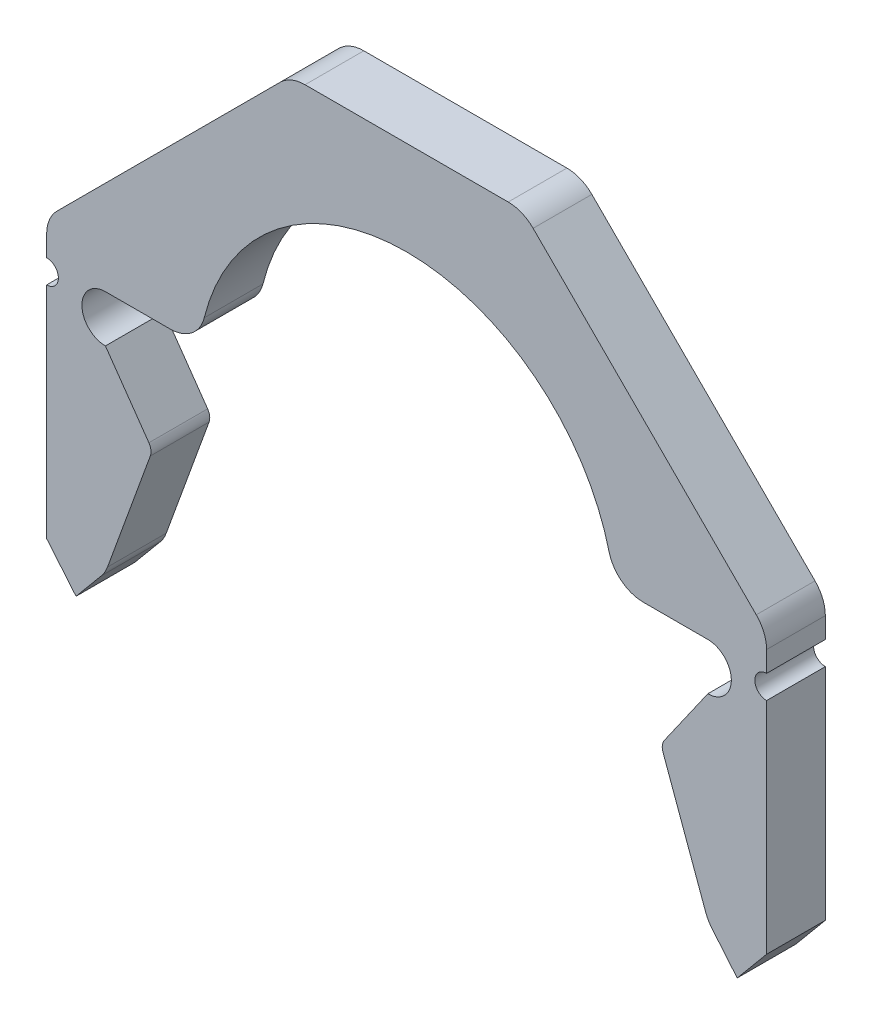
ISO-10303-21;
HEADER;
FILE_DESCRIPTION(('STEP AP214'),'2;1');
FILE_NAME('part.step','',(''),(''),'','','');
FILE_SCHEMA(('AUTOMOTIVE_DESIGN { 1 0 10303 214 1 1 1 1 }'));
ENDSEC;
DATA;
#1=APPLICATION_CONTEXT('core data for automotive mechanical design processes');
#2=APPLICATION_PROTOCOL_DEFINITION('international standard','automotive_design',2000,#1);
#3=PRODUCT_CONTEXT('',#1,'mechanical');
#4=PRODUCT('Part','Part','',(#3));
#5=PRODUCT_RELATED_PRODUCT_CATEGORY('part','',(#4));
#6=PRODUCT_DEFINITION_FORMATION('','',#4);
#7=PRODUCT_DEFINITION_CONTEXT('part definition',#1,'design');
#8=PRODUCT_DEFINITION('design','',#6,#7);
#9=PRODUCT_DEFINITION_SHAPE('','',#8);
#10=(LENGTH_UNIT() NAMED_UNIT(*) SI_UNIT(.MILLI.,.METRE.));
#11=(NAMED_UNIT(*) PLANE_ANGLE_UNIT() SI_UNIT($,.RADIAN.));
#12=(NAMED_UNIT(*) SI_UNIT($,.STERADIAN.) SOLID_ANGLE_UNIT());
#13=UNCERTAINTY_MEASURE_WITH_UNIT(LENGTH_MEASURE(1.E-05),#10,'distance_accuracy_value','');
#14=(GEOMETRIC_REPRESENTATION_CONTEXT(3) GLOBAL_UNCERTAINTY_ASSIGNED_CONTEXT((#13)) GLOBAL_UNIT_ASSIGNED_CONTEXT((#10,
#11,#12)) REPRESENTATION_CONTEXT('',''));
#15=CARTESIAN_POINT('',(0.,0.,0.));
#16=DIRECTION('',(0.,0.,1.));
#17=DIRECTION('',(1.,0.,0.));
#18=AXIS2_PLACEMENT_3D('',#15,#16,#17);
#19=CARTESIAN_POINT('',(-25.6369640244573,0.,2.5));
#20=DIRECTION('',(0.,0.,-1.));
#21=DIRECTION('',(-1.,0.,0.));
#22=AXIS2_PLACEMENT_3D('',#19,#20,#21);
#23=CYLINDRICAL_SURFACE('',#22,2.);
#24=CARTESIAN_POINT('',(-25.6369640244573,0.,-2.5));
#25=DIRECTION('',(0.,0.,1.));
#26=DIRECTION('',(1.,0.,0.));
#27=AXIS2_PLACEMENT_3D('',#24,#25,#26);
#28=CIRCLE('',#27,2.);
#29=CARTESIAN_POINT('',(-25.6369640244573,2.,-2.5));
#30=VERTEX_POINT('',#29);
#31=CARTESIAN_POINT('',(-25.6369640244573,-2.,-2.5));
#32=VERTEX_POINT('',#31);
#33=EDGE_CURVE('E256',#30,#32,#28,.T.);
#34=ORIENTED_EDGE('',*,*,#33,.F.);
#35=DIRECTION('',(0.,0.,-1.));
#36=VECTOR('',#35,1.);
#37=CARTESIAN_POINT('',(-25.6369640244573,2.,2.5));
#38=LINE('',#37,#36);
#39=CARTESIAN_POINT('',(-25.6369640244573,2.,2.5));
#40=VERTEX_POINT('',#39);
#41=EDGE_CURVE('E251',#40,#30,#38,.T.);
#42=ORIENTED_EDGE('',*,*,#41,.F.);
#43=CARTESIAN_POINT('',(-25.6369640244573,0.,2.5));
#44=DIRECTION('',(0.,0.,1.));
#45=DIRECTION('',(1.,0.,0.));
#46=AXIS2_PLACEMENT_3D('',#43,#44,#45);
#47=CIRCLE('',#46,2.);
#48=CARTESIAN_POINT('',(-25.6369640244573,-2.,2.5));
#49=VERTEX_POINT('',#48);
#50=EDGE_CURVE('E254',#40,#49,#47,.T.);
#51=ORIENTED_EDGE('',*,*,#50,.T.);
#52=DIRECTION('',(0.,0.,-1.));
#53=VECTOR('',#52,1.);
#54=CARTESIAN_POINT('',(-25.6369640244573,-2.,2.5));
#55=LINE('',#54,#53);
#56=EDGE_CURVE('E350',#49,#32,#55,.T.);
#57=ORIENTED_EDGE('',*,*,#56,.T.);
#58=EDGE_LOOP('',(#34,#42,#51,#57));
#59=FACE_BOUND('',#58,.T.);
#60=ADVANCED_FACE('F41',(#59),#23,.F.);
#61=CARTESIAN_POINT('',(0.,2.,2.5));
#62=DIRECTION('',(0.,1.,0.));
#63=DIRECTION('',(0.,0.,1.));
#64=AXIS2_PLACEMENT_3D('',#61,#62,#63);
#65=PLANE('',#64);
#66=DIRECTION('',(1.,0.,0.));
#67=VECTOR('',#66,1.);
#68=CARTESIAN_POINT('',(0.,2.,-2.5));
#69=LINE('',#68,#67);
#70=CARTESIAN_POINT('',(-20.1385823731463,2.,-2.5));
#71=VERTEX_POINT('',#70);
#72=EDGE_CURVE('E353',#30,#71,#69,.T.);
#73=ORIENTED_EDGE('',*,*,#72,.T.);
#74=DIRECTION('',(0.,0.,1.));
#75=VECTOR('',#74,1.);
#76=CARTESIAN_POINT('',(-20.1385823731463,2.,2.5));
#77=LINE('',#76,#75);
#78=CARTESIAN_POINT('',(-20.1385823731463,2.,2.5));
#79=VERTEX_POINT('',#78);
#80=EDGE_CURVE('E268',#71,#79,#77,.T.);
#81=ORIENTED_EDGE('',*,*,#80,.T.);
#82=DIRECTION('',(1.,0.,0.));
#83=VECTOR('',#82,1.);
#84=CARTESIAN_POINT('',(0.,2.,2.5));
#85=LINE('',#84,#83);
#86=EDGE_CURVE('E265',#40,#79,#85,.T.);
#87=ORIENTED_EDGE('',*,*,#86,.F.);
#88=ORIENTED_EDGE('',*,*,#41,.T.);
#89=EDGE_LOOP('',(#73,#81,#87,#88));
#90=FACE_BOUND('',#89,.T.);
#91=ADVANCED_FACE('F266',(#90),#65,.F.);
#92=CARTESIAN_POINT('',(0.,0.,2.5));
#93=DIRECTION('',(0.,0.,-1.));
#94=DIRECTION('',(-1.,0.,0.));
#95=AXIS2_PLACEMENT_3D('',#92,#93,#94);
#96=CYLINDRICAL_SURFACE('',#95,17.75);
#97=CARTESIAN_POINT('',(0.,0.,-2.5));
#98=DIRECTION('',(0.,0.,1.));
#99=DIRECTION('',(1.,0.,0.));
#100=AXIS2_PLACEMENT_3D('',#97,#98,#99);
#101=CIRCLE('',#100,17.75);
#102=CARTESIAN_POINT('',(17.22698010233,4.27710843373494,-2.5));
#103=VERTEX_POINT('',#102);
#104=CARTESIAN_POINT('',(-17.22698010233,4.27710843373494,-2.5));
#105=VERTEX_POINT('',#104);
#106=EDGE_CURVE('E356',#103,#105,#101,.T.);
#107=ORIENTED_EDGE('',*,*,#106,.F.);
#108=DIRECTION('',(0.,0.,-1.));
#109=VECTOR('',#108,1.);
#110=CARTESIAN_POINT('',(17.22698010233,4.27710843373494,2.5));
#111=LINE('',#110,#109);
#112=CARTESIAN_POINT('',(17.22698010233,4.27710843373494,2.5));
#113=VERTEX_POINT('',#112);
#114=EDGE_CURVE('E560',#103,#113,#111,.F.);
#115=ORIENTED_EDGE('',*,*,#114,.T.);
#116=CARTESIAN_POINT('',(0.,0.,2.5));
#117=DIRECTION('',(0.,0.,1.));
#118=DIRECTION('',(1.,0.,0.));
#119=AXIS2_PLACEMENT_3D('',#116,#117,#118);
#120=CIRCLE('',#119,17.75);
#121=CARTESIAN_POINT('',(-17.22698010233,4.27710843373494,2.5));
#122=VERTEX_POINT('',#121);
#123=EDGE_CURVE('E271',#113,#122,#120,.T.);
#124=ORIENTED_EDGE('',*,*,#123,.T.);
#125=DIRECTION('',(0.,0.,-1.));
#126=VECTOR('',#125,1.);
#127=CARTESIAN_POINT('',(-17.22698010233,4.27710843373494,2.5));
#128=LINE('',#127,#126);
#129=EDGE_CURVE('E556',#122,#105,#128,.T.);
#130=ORIENTED_EDGE('',*,*,#129,.T.);
#131=EDGE_LOOP('',(#107,#115,#124,#130));
#132=FACE_BOUND('',#131,.T.);
#133=ADVANCED_FACE('F599',(#132),#96,.F.);
#134=CARTESIAN_POINT('',(0.,2.,2.5));
#135=DIRECTION('',(0.,-1.,0.));
#136=DIRECTION('',(0.,0.,-1.));
#137=AXIS2_PLACEMENT_3D('',#134,#135,#136);
#138=PLANE('',#137);
#139=DIRECTION('',(-1.,0.,0.));
#140=VECTOR('',#139,1.);
#141=CARTESIAN_POINT('',(0.,2.,2.5));
#142=LINE('',#141,#140);
#143=CARTESIAN_POINT('',(25.6369640244573,2.,2.5));
#144=VERTEX_POINT('',#143);
#145=CARTESIAN_POINT('',(20.1385823731463,2.,2.5));
#146=VERTEX_POINT('',#145);
#147=EDGE_CURVE('E287',#144,#146,#142,.T.);
#148=ORIENTED_EDGE('',*,*,#147,.T.);
#149=DIRECTION('',(0.,0.,-1.));
#150=VECTOR('',#149,1.);
#151=CARTESIAN_POINT('',(20.1385823731463,2.,2.5));
#152=LINE('',#151,#150);
#153=CARTESIAN_POINT('',(20.1385823731463,2.,-2.5));
#154=VERTEX_POINT('',#153);
#155=EDGE_CURVE('E552',#146,#154,#152,.T.);
#156=ORIENTED_EDGE('',*,*,#155,.T.);
#157=DIRECTION('',(-1.,0.,0.));
#158=VECTOR('',#157,1.);
#159=CARTESIAN_POINT('',(0.,2.,-2.5));
#160=LINE('',#159,#158);
#161=CARTESIAN_POINT('',(25.6369640244573,2.,-2.5));
#162=VERTEX_POINT('',#161);
#163=EDGE_CURVE('E360',#162,#154,#160,.T.);
#164=ORIENTED_EDGE('',*,*,#163,.F.);
#165=DIRECTION('',(0.,0.,-1.));
#166=VECTOR('',#165,1.);
#167=CARTESIAN_POINT('',(25.6369640244573,2.,2.5));
#168=LINE('',#167,#166);
#169=EDGE_CURVE('E262',#144,#162,#168,.T.);
#170=ORIENTED_EDGE('',*,*,#169,.F.);
#171=EDGE_LOOP('',(#148,#156,#164,#170));
#172=FACE_BOUND('',#171,.T.);
#173=ADVANCED_FACE('F606',(#172),#138,.T.);
#174=CARTESIAN_POINT('',(25.6369640244573,0.,2.5));
#175=DIRECTION('',(0.,0.,-1.));
#176=DIRECTION('',(-1.,0.,0.));
#177=AXIS2_PLACEMENT_3D('',#174,#175,#176);
#178=CYLINDRICAL_SURFACE('',#177,2.);
#179=CARTESIAN_POINT('',(25.6369640244573,0.,-2.5));
#180=DIRECTION('',(0.,0.,1.));
#181=DIRECTION('',(1.,0.,0.));
#182=AXIS2_PLACEMENT_3D('',#179,#180,#181);
#183=CIRCLE('',#182,2.);
#184=CARTESIAN_POINT('',(25.6369640244573,-2.,-2.5));
#185=VERTEX_POINT('',#184);
#186=EDGE_CURVE('E364',#162,#185,#183,.F.);
#187=ORIENTED_EDGE('',*,*,#186,.T.);
#188=DIRECTION('',(0.,0.,-1.));
#189=VECTOR('',#188,1.);
#190=CARTESIAN_POINT('',(25.6369640244573,-2.,2.5));
#191=LINE('',#190,#189);
#192=CARTESIAN_POINT('',(25.6369640244573,-2.,2.5));
#193=VERTEX_POINT('',#192);
#194=EDGE_CURVE('E454',#193,#185,#191,.T.);
#195=ORIENTED_EDGE('',*,*,#194,.F.);
#196=CARTESIAN_POINT('',(25.6369640244573,0.,2.5));
#197=DIRECTION('',(0.,0.,1.));
#198=DIRECTION('',(1.,0.,0.));
#199=AXIS2_PLACEMENT_3D('',#196,#197,#198);
#200=CIRCLE('',#199,2.);
#201=EDGE_CURVE('E291',#144,#193,#200,.F.);
#202=ORIENTED_EDGE('',*,*,#201,.F.);
#203=ORIENTED_EDGE('',*,*,#169,.T.);
#204=EDGE_LOOP('',(#187,#195,#202,#203));
#205=FACE_BOUND('',#204,.T.);
#206=ADVANCED_FACE('F612',(#205),#178,.F.);
#207=CARTESIAN_POINT('',(18.1423536880544,-12.7034128132425,2.5));
#208=DIRECTION('',(0.819152044288989,-0.57357643635105,0.));
#209=DIRECTION('',(0.57357643635105,0.819152044288989,0.));
#210=AXIS2_PLACEMENT_3D('',#207,#208,#209);
#211=PLANE('',#210);
#212=DIRECTION('',(-0.57357643635105,-0.819152044288989,0.));
#213=VECTOR('',#212,1.);
#214=CARTESIAN_POINT('',(18.1423536880544,-12.7034128132425,-2.5));
#215=LINE('',#214,#213);
#216=CARTESIAN_POINT('',(21.9355490181945,-7.28616846331944,-2.5));
#217=VERTEX_POINT('',#216);
#218=EDGE_CURVE('E367',#185,#217,#215,.T.);
#219=ORIENTED_EDGE('',*,*,#218,.T.);
#220=DIRECTION('',(0.,0.,-1.));
#221=VECTOR('',#220,1.);
#222=CARTESIAN_POINT('',(21.9355490181945,-7.28616846331945,2.5));
#223=LINE('',#222,#221);
#224=CARTESIAN_POINT('',(21.9355490181945,-7.28616846331944,2.5));
#225=VERTEX_POINT('',#224);
#226=EDGE_CURVE('E575',#217,#225,#223,.F.);
#227=ORIENTED_EDGE('',*,*,#226,.T.);
#228=DIRECTION('',(-0.57357643635105,-0.819152044288989,0.));
#229=VECTOR('',#228,1.);
#230=CARTESIAN_POINT('',(18.1423536880544,-12.7034128132425,2.5));
#231=LINE('',#230,#229);
#232=EDGE_CURVE('E294',#193,#225,#231,.T.);
#233=ORIENTED_EDGE('',*,*,#232,.F.);
#234=ORIENTED_EDGE('',*,*,#194,.T.);
#235=EDGE_LOOP('',(#219,#227,#233,#234));
#236=FACE_BOUND('',#235,.T.);
#237=ADVANCED_FACE('F800',(#236),#211,.F.);
#238=CARTESIAN_POINT('',(16.6271407439279,6.05178431174444,2.5));
#239=DIRECTION('',(0.93969262078591,0.342020143325663,0.));
#240=DIRECTION('',(-0.342020143325663,0.93969262078591,0.));
#241=AXIS2_PLACEMENT_3D('',#238,#239,#240);
#242=PLANE('',#241);
#243=DIRECTION('',(0.342020143325663,-0.939692620785911,0.));
#244=VECTOR('',#243,1.);
#245=CARTESIAN_POINT('',(16.6271407439279,6.05178431174444,2.5));
#246=LINE('',#245,#244);
#247=CARTESIAN_POINT('',(21.8150084416976,-8.20176504299616,2.5));
#248=VERTEX_POINT('',#247);
#249=CARTESIAN_POINT('',(25.4578364086014,-18.2103526250223,2.5));
#250=VERTEX_POINT('',#249);
#251=EDGE_CURVE('E297',#248,#250,#246,.T.);
#252=ORIENTED_EDGE('',*,*,#251,.F.);
#253=DIRECTION('',(0.,0.,-1.));
#254=VECTOR('',#253,1.);
#255=CARTESIAN_POINT('',(21.8150084416976,-8.20176504299616,2.5));
#256=LINE('',#255,#254);
#257=CARTESIAN_POINT('',(21.8150084416976,-8.20176504299616,-2.5));
#258=VERTEX_POINT('',#257);
#259=EDGE_CURVE('E565',#248,#258,#256,.T.);
#260=ORIENTED_EDGE('',*,*,#259,.T.);
#261=DIRECTION('',(0.342020143325663,-0.939692620785911,0.));
#262=VECTOR('',#261,1.);
#263=CARTESIAN_POINT('',(16.6271407439279,6.05178431174444,-2.5));
#264=LINE('',#263,#262);
#265=CARTESIAN_POINT('',(25.4578364086014,-18.2103526250223,-2.5));
#266=VERTEX_POINT('',#265);
#267=EDGE_CURVE('E371',#258,#266,#264,.T.);
#268=ORIENTED_EDGE('',*,*,#267,.T.);
#269=DIRECTION('',(0.,0.,-1.));
#270=VECTOR('',#269,1.);
#271=CARTESIAN_POINT('',(25.4578364086014,-18.2103526250223,2.5));
#272=LINE('',#271,#270);
#273=EDGE_CURVE('E488',#266,#250,#272,.F.);
#274=ORIENTED_EDGE('',*,*,#273,.T.);
#275=EDGE_LOOP('',(#252,#260,#268,#274));
#276=FACE_BOUND('',#275,.T.);
#277=ADVANCED_FACE('F622',(#276),#242,.F.);
#278=CARTESIAN_POINT('',(5.93205989732539,4.94338324777116,2.5));
#279=DIRECTION('',(0.768221279597376,0.64018439966448,0.));
#280=DIRECTION('',(-0.64018439966448,0.768221279597376,0.));
#281=AXIS2_PLACEMENT_3D('',#278,#279,#280);
#282=PLANE('',#281);
#283=DIRECTION('',(0.64018439966448,-0.768221279597376,0.));
#284=VECTOR('',#283,1.);
#285=CARTESIAN_POINT('',(5.93205989732539,4.94338324777116,2.5));
#286=LINE('',#285,#284);
#287=CARTESIAN_POINT('',(25.972250432167,-19.1048453940388,2.5));
#288=VERTEX_POINT('',#287);
#289=CARTESIAN_POINT('',(28.1369640244573,-21.7025017047871,2.5));
#290=VERTEX_POINT('',#289);
#291=EDGE_CURVE('E300',#288,#290,#286,.T.);
#292=ORIENTED_EDGE('',*,*,#291,.F.);
#293=DIRECTION('',(0.,0.,-1.));
#294=VECTOR('',#293,1.);
#295=CARTESIAN_POINT('',(25.972250432167,-19.1048453940388,2.5));
#296=LINE('',#295,#294);
#297=CARTESIAN_POINT('',(25.972250432167,-19.1048453940388,-2.5));
#298=VERTEX_POINT('',#297);
#299=EDGE_CURVE('E261',#288,#298,#296,.T.);
#300=ORIENTED_EDGE('',*,*,#299,.T.);
#301=DIRECTION('',(0.64018439966448,-0.768221279597376,0.));
#302=VECTOR('',#301,1.);
#303=CARTESIAN_POINT('',(5.93205989732539,4.94338324777116,-2.5));
#304=LINE('',#303,#302);
#305=CARTESIAN_POINT('',(28.1369640244573,-21.7025017047871,-2.5));
#306=VERTEX_POINT('',#305);
#307=EDGE_CURVE('E374',#298,#306,#304,.T.);
#308=ORIENTED_EDGE('',*,*,#307,.T.);
#309=DIRECTION('',(0.,0.,-1.));
#310=VECTOR('',#309,1.);
#311=CARTESIAN_POINT('',(28.1369640244573,-21.7025017047871,2.5));
#312=LINE('',#311,#310);
#313=EDGE_CURVE('E450',#290,#306,#312,.T.);
#314=ORIENTED_EDGE('',*,*,#313,.F.);
#315=EDGE_LOOP('',(#292,#300,#308,#314));
#316=FACE_BOUND('',#315,.T.);
#317=ADVANCED_FACE('F634',(#316),#282,.F.);
#318=CARTESIAN_POINT('',(27.2787828856406,-22.7323190713671,2.5));
#319=DIRECTION('',(-0.768221279597376,0.64018439966448,0.));
#320=DIRECTION('',(-0.64018439966448,-0.768221279597376,0.));
#321=AXIS2_PLACEMENT_3D('',#318,#319,#320);
#322=PLANE('',#321);
#323=DIRECTION('',(0.64018439966448,0.768221279597376,0.));
#324=VECTOR('',#323,1.);
#325=CARTESIAN_POINT('',(27.2787828856406,-22.7323190713671,-2.5));
#326=LINE('',#325,#324);
#327=CARTESIAN_POINT('',(30.6369640244573,-18.7025017047871,-2.5));
#328=VERTEX_POINT('',#327);
#329=EDGE_CURVE('E377',#306,#328,#326,.T.);
#330=ORIENTED_EDGE('',*,*,#329,.T.);
#331=DIRECTION('',(0.,0.,-1.));
#332=VECTOR('',#331,1.);
#333=CARTESIAN_POINT('',(30.6369640244573,-18.7025017047871,2.5));
#334=LINE('',#333,#332);
#335=CARTESIAN_POINT('',(30.6369640244573,-18.7025017047871,2.5));
#336=VERTEX_POINT('',#335);
#337=EDGE_CURVE('E447',#336,#328,#334,.T.);
#338=ORIENTED_EDGE('',*,*,#337,.F.);
#339=DIRECTION('',(0.64018439966448,0.768221279597376,0.));
#340=VECTOR('',#339,1.);
#341=CARTESIAN_POINT('',(27.2787828856406,-22.7323190713671,2.5));
#342=LINE('',#341,#340);
#343=EDGE_CURVE('E303',#290,#336,#342,.T.);
#344=ORIENTED_EDGE('',*,*,#343,.F.);
#345=ORIENTED_EDGE('',*,*,#313,.T.);
#346=EDGE_LOOP('',(#330,#338,#344,#345));
#347=FACE_BOUND('',#346,.T.);
#348=ADVANCED_FACE('F638',(#347),#322,.F.);
#349=CARTESIAN_POINT('',(30.6369640244573,0.,2.5));
#350=DIRECTION('',(1.,0.,0.));
#351=DIRECTION('',(0.,1.,0.));
#352=AXIS2_PLACEMENT_3D('',#349,#350,#351);
#353=PLANE('',#352);
#354=DIRECTION('',(0.,-1.,0.));
#355=VECTOR('',#354,1.);
#356=CARTESIAN_POINT('',(30.6369640244573,0.,-2.5));
#357=LINE('',#356,#355);
#358=CARTESIAN_POINT('',(30.6369640244573,0.,-2.5));
#359=VERTEX_POINT('',#358);
#360=EDGE_CURVE('E381',#359,#328,#357,.T.);
#361=ORIENTED_EDGE('',*,*,#360,.F.);
#362=DIRECTION('',(0.,0.,-1.));
#363=VECTOR('',#362,1.);
#364=CARTESIAN_POINT('',(30.6369640244573,0.,2.5));
#365=LINE('',#364,#363);
#366=CARTESIAN_POINT('',(30.6369640244573,0.,2.5));
#367=VERTEX_POINT('',#366);
#368=EDGE_CURVE('E444',#367,#359,#365,.T.);
#369=ORIENTED_EDGE('',*,*,#368,.F.);
#370=DIRECTION('',(0.,-1.,0.));
#371=VECTOR('',#370,1.);
#372=CARTESIAN_POINT('',(30.6369640244573,0.,2.5));
#373=LINE('',#372,#371);
#374=EDGE_CURVE('E306',#367,#336,#373,.T.);
#375=ORIENTED_EDGE('',*,*,#374,.T.);
#376=ORIENTED_EDGE('',*,*,#337,.T.);
#377=EDGE_LOOP('',(#361,#369,#375,#376));
#378=FACE_BOUND('',#377,.T.);
#379=ADVANCED_FACE('F871',(#378),#353,.T.);
#380=CARTESIAN_POINT('',(30.6369640244573,1.,2.5));
#381=DIRECTION('',(0.,0.,-1.));
#382=DIRECTION('',(-1.,0.,0.));
#383=AXIS2_PLACEMENT_3D('',#380,#381,#382);
#384=CYLINDRICAL_SURFACE('',#383,1.);
#385=CARTESIAN_POINT('',(30.6369640244573,1.,-2.5));
#386=DIRECTION('',(0.,0.,1.));
#387=DIRECTION('',(1.,0.,0.));
#388=AXIS2_PLACEMENT_3D('',#385,#386,#387);
#389=CIRCLE('',#388,1.);
#390=CARTESIAN_POINT('',(30.6369640244573,2.,-2.5));
#391=VERTEX_POINT('',#390);
#392=EDGE_CURVE('E385',#391,#359,#389,.T.);
#393=ORIENTED_EDGE('',*,*,#392,.F.);
#394=DIRECTION('',(0.,0.,-1.));
#395=VECTOR('',#394,1.);
#396=CARTESIAN_POINT('',(30.6369640244573,2.,2.5));
#397=LINE('',#396,#395);
#398=CARTESIAN_POINT('',(30.6369640244573,2.,2.5));
#399=VERTEX_POINT('',#398);
#400=EDGE_CURVE('E440',#399,#391,#397,.T.);
#401=ORIENTED_EDGE('',*,*,#400,.F.);
#402=CARTESIAN_POINT('',(30.6369640244573,1.,2.5));
#403=DIRECTION('',(0.,0.,1.));
#404=DIRECTION('',(1.,0.,0.));
#405=AXIS2_PLACEMENT_3D('',#402,#403,#404);
#406=CIRCLE('',#405,1.);
#407=EDGE_CURVE('E310',#399,#367,#406,.T.);
#408=ORIENTED_EDGE('',*,*,#407,.T.);
#409=ORIENTED_EDGE('',*,*,#368,.T.);
#410=EDGE_LOOP('',(#393,#401,#408,#409));
#411=FACE_BOUND('',#410,.T.);
#412=ADVANCED_FACE('F646',(#411),#384,.F.);
#413=CARTESIAN_POINT('',(30.6369640244573,0.,2.5));
#414=DIRECTION('',(1.,0.,0.));
#415=DIRECTION('',(0.,0.,-1.));
#416=AXIS2_PLACEMENT_3D('',#413,#414,#415);
#417=PLANE('',#416);
#418=DIRECTION('',(0.,-1.,0.));
#419=VECTOR('',#418,1.);
#420=CARTESIAN_POINT('',(30.6369640244573,0.,-2.5));
#421=LINE('',#420,#419);
#422=CARTESIAN_POINT('',(30.6369640244573,3.75735931288072,-2.5));
#423=VERTEX_POINT('',#422);
#424=EDGE_CURVE('E389',#423,#391,#421,.T.);
#425=ORIENTED_EDGE('',*,*,#424,.F.);
#426=DIRECTION('',(0.,0.,-1.));
#427=VECTOR('',#426,1.);
#428=CARTESIAN_POINT('',(30.6369640244573,3.75735931288072,2.5));
#429=LINE('',#428,#427);
#430=CARTESIAN_POINT('',(30.6369640244573,3.75735931288072,2.5));
#431=VERTEX_POINT('',#430);
#432=EDGE_CURVE('E542',#423,#431,#429,.F.);
#433=ORIENTED_EDGE('',*,*,#432,.T.);
#434=DIRECTION('',(0.,-1.,0.));
#435=VECTOR('',#434,1.);
#436=CARTESIAN_POINT('',(30.6369640244573,0.,2.5));
#437=LINE('',#436,#435);
#438=EDGE_CURVE('E314',#431,#399,#437,.T.);
#439=ORIENTED_EDGE('',*,*,#438,.T.);
#440=ORIENTED_EDGE('',*,*,#400,.T.);
#441=EDGE_LOOP('',(#425,#433,#439,#440));
#442=FACE_BOUND('',#441,.T.);
#443=ADVANCED_FACE('F650',(#442),#417,.T.);
#444=CARTESIAN_POINT('',(17.8184820122286,17.8184820122287,2.5));
#445=DIRECTION('',(-0.707106781186546,-0.707106781186549,0.));
#446=DIRECTION('',(0.707106781186549,-0.707106781186546,0.));
#447=AXIS2_PLACEMENT_3D('',#444,#445,#446);
#448=PLANE('',#447);
#449=DIRECTION('',(-0.707106781186549,0.707106781186546,0.));
#450=VECTOR('',#449,1.);
#451=CARTESIAN_POINT('',(17.8184820122286,17.8184820122287,2.5));
#452=LINE('',#451,#450);
#453=CARTESIAN_POINT('',(29.7582843680169,5.87867965644037,2.5));
#454=VERTEX_POINT('',#453);
#455=CARTESIAN_POINT('',(10.7656436808976,24.8713203435596,2.5));
#456=VERTEX_POINT('',#455);
#457=EDGE_CURVE('E317',#454,#456,#452,.T.);
#458=ORIENTED_EDGE('',*,*,#457,.F.);
#459=DIRECTION('',(0.,0.,-1.));
#460=VECTOR('',#459,1.);
#461=CARTESIAN_POINT('',(29.7582843680169,5.87867965644037,-2.5));
#462=LINE('',#461,#460);
#463=CARTESIAN_POINT('',(29.7582843680169,5.87867965644037,-2.5));
#464=VERTEX_POINT('',#463);
#465=EDGE_CURVE('E538',#454,#464,#462,.T.);
#466=ORIENTED_EDGE('',*,*,#465,.T.);
#467=DIRECTION('',(-0.707106781186549,0.707106781186546,0.));
#468=VECTOR('',#467,1.);
#469=CARTESIAN_POINT('',(17.8184820122286,17.8184820122287,-2.5));
#470=LINE('',#469,#468);
#471=CARTESIAN_POINT('',(10.7656436808976,24.8713203435596,-2.5));
#472=VERTEX_POINT('',#471);
#473=EDGE_CURVE('E392',#464,#472,#470,.T.);
#474=ORIENTED_EDGE('',*,*,#473,.T.);
#475=DIRECTION('',(0.,0.,-1.));
#476=VECTOR('',#475,1.);
#477=CARTESIAN_POINT('',(10.7656436808976,24.8713203435596,2.5));
#478=LINE('',#477,#476);
#479=EDGE_CURVE('E535',#472,#456,#478,.F.);
#480=ORIENTED_EDGE('',*,*,#479,.T.);
#481=EDGE_LOOP('',(#458,#466,#474,#480));
#482=FACE_BOUND('',#481,.T.);
#483=ADVANCED_FACE('F659',(#482),#448,.F.);
#484=CARTESIAN_POINT('',(0.,25.75,2.5));
#485=DIRECTION('',(0.,-1.,0.));
#486=DIRECTION('',(0.,0.,-1.));
#487=AXIS2_PLACEMENT_3D('',#484,#485,#486);
#488=PLANE('',#487);
#489=DIRECTION('',(-1.,0.,0.));
#490=VECTOR('',#489,1.);
#491=CARTESIAN_POINT('',(0.,25.75,-2.5));
#492=LINE('',#491,#490);
#493=CARTESIAN_POINT('',(8.64432333733793,25.75,-2.5));
#494=VERTEX_POINT('',#493);
#495=CARTESIAN_POINT('',(-8.64432333733792,25.75,-2.5));
#496=VERTEX_POINT('',#495);
#497=EDGE_CURVE('E396',#494,#496,#492,.T.);
#498=ORIENTED_EDGE('',*,*,#497,.T.);
#499=DIRECTION('',(0.,0.,-1.));
#500=VECTOR('',#499,1.);
#501=CARTESIAN_POINT('',(-8.64432333733792,25.75,2.5));
#502=LINE('',#501,#500);
#503=CARTESIAN_POINT('',(-8.64432333733792,25.75,2.5));
#504=VERTEX_POINT('',#503);
#505=EDGE_CURVE('E549',#496,#504,#502,.F.);
#506=ORIENTED_EDGE('',*,*,#505,.T.);
#507=DIRECTION('',(-1.,0.,0.));
#508=VECTOR('',#507,1.);
#509=CARTESIAN_POINT('',(0.,25.75,2.5));
#510=LINE('',#509,#508);
#511=CARTESIAN_POINT('',(8.64432333733793,25.75,2.5));
#512=VERTEX_POINT('',#511);
#513=EDGE_CURVE('E321',#512,#504,#510,.T.);
#514=ORIENTED_EDGE('',*,*,#513,.F.);
#515=DIRECTION('',(0.,0.,-1.));
#516=VECTOR('',#515,1.);
#517=CARTESIAN_POINT('',(8.64432333733793,25.75,2.5));
#518=LINE('',#517,#516);
#519=EDGE_CURVE('E545',#512,#494,#518,.T.);
#520=ORIENTED_EDGE('',*,*,#519,.T.);
#521=EDGE_LOOP('',(#498,#506,#514,#520));
#522=FACE_BOUND('',#521,.T.);
#523=ADVANCED_FACE('F668',(#522),#488,.F.);
#524=CARTESIAN_POINT('',(-17.8184820122286,17.8184820122287,2.5));
#525=DIRECTION('',(-0.707106781186546,0.707106781186549,0.));
#526=DIRECTION('',(-0.707106781186549,-0.707106781186546,0.));
#527=AXIS2_PLACEMENT_3D('',#524,#525,#526);
#528=PLANE('',#527);
#529=DIRECTION('',(0.707106781186549,0.707106781186546,0.));
#530=VECTOR('',#529,1.);
#531=CARTESIAN_POINT('',(-17.8184820122286,17.8184820122287,-2.5));
#532=LINE('',#531,#530);
#533=CARTESIAN_POINT('',(-29.7582843680169,5.87867965644038,-2.5));
#534=VERTEX_POINT('',#533);
#535=CARTESIAN_POINT('',(-10.7656436808976,24.8713203435597,-2.5));
#536=VERTEX_POINT('',#535);
#537=EDGE_CURVE('E400',#534,#536,#532,.T.);
#538=ORIENTED_EDGE('',*,*,#537,.F.);
#539=DIRECTION('',(0.,0.,-1.));
#540=VECTOR('',#539,1.);
#541=CARTESIAN_POINT('',(-29.7582843680169,5.87867965644038,2.5));
#542=LINE('',#541,#540);
#543=CARTESIAN_POINT('',(-29.7582843680169,5.87867965644038,2.5));
#544=VERTEX_POINT('',#543);
#545=EDGE_CURVE('E532',#534,#544,#542,.F.);
#546=ORIENTED_EDGE('',*,*,#545,.T.);
#547=DIRECTION('',(0.707106781186549,0.707106781186546,0.));
#548=VECTOR('',#547,1.);
#549=CARTESIAN_POINT('',(-17.8184820122286,17.8184820122287,2.5));
#550=LINE('',#549,#548);
#551=CARTESIAN_POINT('',(-10.7656436808976,24.8713203435597,2.5));
#552=VERTEX_POINT('',#551);
#553=EDGE_CURVE('E325',#544,#552,#550,.T.);
#554=ORIENTED_EDGE('',*,*,#553,.T.);
#555=DIRECTION('',(0.,0.,-1.));
#556=VECTOR('',#555,1.);
#557=CARTESIAN_POINT('',(-10.7656436808976,24.8713203435597,-2.5));
#558=LINE('',#557,#556);
#559=EDGE_CURVE('E528',#552,#536,#558,.T.);
#560=ORIENTED_EDGE('',*,*,#559,.T.);
#561=EDGE_LOOP('',(#538,#546,#554,#560));
#562=FACE_BOUND('',#561,.T.);
#563=ADVANCED_FACE('F677',(#562),#528,.T.);
#564=CARTESIAN_POINT('',(-30.6369640244573,0.,2.5));
#565=DIRECTION('',(1.,0.,0.));
#566=DIRECTION('',(0.,0.,-1.));
#567=AXIS2_PLACEMENT_3D('',#564,#565,#566);
#568=PLANE('',#567);
#569=DIRECTION('',(0.,-1.,0.));
#570=VECTOR('',#569,1.);
#571=CARTESIAN_POINT('',(-30.6369640244573,0.,2.5));
#572=LINE('',#571,#570);
#573=CARTESIAN_POINT('',(-30.6369640244573,3.75735931288073,2.5));
#574=VERTEX_POINT('',#573);
#575=CARTESIAN_POINT('',(-30.6369640244573,2.,2.5));
#576=VERTEX_POINT('',#575);
#577=EDGE_CURVE('E329',#574,#576,#572,.T.);
#578=ORIENTED_EDGE('',*,*,#577,.F.);
#579=DIRECTION('',(0.,0.,-1.));
#580=VECTOR('',#579,1.);
#581=CARTESIAN_POINT('',(-30.6369640244573,3.75735931288073,-2.5));
#582=LINE('',#581,#580);
#583=CARTESIAN_POINT('',(-30.6369640244573,3.75735931288073,-2.5));
#584=VERTEX_POINT('',#583);
#585=EDGE_CURVE('E524',#574,#584,#582,.T.);
#586=ORIENTED_EDGE('',*,*,#585,.T.);
#587=DIRECTION('',(0.,-1.,0.));
#588=VECTOR('',#587,1.);
#589=CARTESIAN_POINT('',(-30.6369640244573,0.,-2.5));
#590=LINE('',#589,#588);
#591=CARTESIAN_POINT('',(-30.6369640244573,2.,-2.5));
#592=VERTEX_POINT('',#591);
#593=EDGE_CURVE('E404',#584,#592,#590,.T.);
#594=ORIENTED_EDGE('',*,*,#593,.T.);
#595=DIRECTION('',(0.,0.,-1.));
#596=VECTOR('',#595,1.);
#597=CARTESIAN_POINT('',(-30.6369640244573,2.,2.5));
#598=LINE('',#597,#596);
#599=EDGE_CURVE('E436',#576,#592,#598,.T.);
#600=ORIENTED_EDGE('',*,*,#599,.F.);
#601=EDGE_LOOP('',(#578,#586,#594,#600));
#602=FACE_BOUND('',#601,.T.);
#603=ADVANCED_FACE('F687',(#602),#568,.F.);
#604=CARTESIAN_POINT('',(-30.6369640244573,1.,2.5));
#605=DIRECTION('',(0.,0.,-1.));
#606=DIRECTION('',(-1.,0.,0.));
#607=AXIS2_PLACEMENT_3D('',#604,#605,#606);
#608=CYLINDRICAL_SURFACE('',#607,1.);
#609=CARTESIAN_POINT('',(-30.6369640244573,1.,-2.5));
#610=DIRECTION('',(0.,0.,1.));
#611=DIRECTION('',(1.,0.,0.));
#612=AXIS2_PLACEMENT_3D('',#609,#610,#611);
#613=CIRCLE('',#612,1.);
#614=CARTESIAN_POINT('',(-30.6369640244573,0.,-2.5));
#615=VERTEX_POINT('',#614);
#616=EDGE_CURVE('E407',#592,#615,#613,.F.);
#617=ORIENTED_EDGE('',*,*,#616,.T.);
#618=DIRECTION('',(0.,0.,-1.));
#619=VECTOR('',#618,1.);
#620=CARTESIAN_POINT('',(-30.6369640244573,0.,2.5));
#621=LINE('',#620,#619);
#622=CARTESIAN_POINT('',(-30.6369640244573,0.,2.5));
#623=VERTEX_POINT('',#622);
#624=EDGE_CURVE('E432',#623,#615,#621,.T.);
#625=ORIENTED_EDGE('',*,*,#624,.F.);
#626=CARTESIAN_POINT('',(-30.6369640244573,1.,2.5));
#627=DIRECTION('',(0.,0.,1.));
#628=DIRECTION('',(1.,0.,0.));
#629=AXIS2_PLACEMENT_3D('',#626,#627,#628);
#630=CIRCLE('',#629,1.);
#631=EDGE_CURVE('E332',#576,#623,#630,.F.);
#632=ORIENTED_EDGE('',*,*,#631,.F.);
#633=ORIENTED_EDGE('',*,*,#599,.T.);
#634=EDGE_LOOP('',(#617,#625,#632,#633));
#635=FACE_BOUND('',#634,.T.);
#636=ADVANCED_FACE('F695',(#635),#608,.F.);
#637=CARTESIAN_POINT('',(-30.6369640244573,0.,2.5));
#638=DIRECTION('',(1.,0.,0.));
#639=DIRECTION('',(0.,1.,0.));
#640=AXIS2_PLACEMENT_3D('',#637,#638,#639);
#641=PLANE('',#640);
#642=DIRECTION('',(0.,-1.,0.));
#643=VECTOR('',#642,1.);
#644=CARTESIAN_POINT('',(-30.6369640244573,0.,-2.5));
#645=LINE('',#644,#643);
#646=CARTESIAN_POINT('',(-30.6369640244573,-18.7025017047871,-2.5));
#647=VERTEX_POINT('',#646);
#648=EDGE_CURVE('E410',#615,#647,#645,.T.);
#649=ORIENTED_EDGE('',*,*,#648,.T.);
#650=DIRECTION('',(0.,0.,-1.));
#651=VECTOR('',#650,1.);
#652=CARTESIAN_POINT('',(-30.6369640244573,-18.7025017047871,2.5));
#653=LINE('',#652,#651);
#654=CARTESIAN_POINT('',(-30.6369640244573,-18.7025017047871,2.5));
#655=VERTEX_POINT('',#654);
#656=EDGE_CURVE('E429',#655,#647,#653,.T.);
#657=ORIENTED_EDGE('',*,*,#656,.F.);
#658=DIRECTION('',(0.,-1.,0.));
#659=VECTOR('',#658,1.);
#660=CARTESIAN_POINT('',(-30.6369640244573,0.,2.5));
#661=LINE('',#660,#659);
#662=EDGE_CURVE('E335',#623,#655,#661,.T.);
#663=ORIENTED_EDGE('',*,*,#662,.F.);
#664=ORIENTED_EDGE('',*,*,#624,.T.);
#665=EDGE_LOOP('',(#649,#657,#663,#664));
#666=FACE_BOUND('',#665,.T.);
#667=ADVANCED_FACE('F698',(#666),#641,.F.);
#668=CARTESIAN_POINT('',(-27.2787828856405,-22.7323190713672,2.5));
#669=DIRECTION('',(-0.768221279597375,-0.640184399664481,0.));
#670=DIRECTION('',(0.640184399664481,-0.768221279597375,0.));
#671=AXIS2_PLACEMENT_3D('',#668,#669,#670);
#672=PLANE('',#671);
#673=DIRECTION('',(-0.640184399664481,0.768221279597375,0.));
#674=VECTOR('',#673,1.);
#675=CARTESIAN_POINT('',(-27.2787828856405,-22.7323190713672,-2.5));
#676=LINE('',#675,#674);
#677=CARTESIAN_POINT('',(-28.1369640244573,-21.7025017047871,-2.5));
#678=VERTEX_POINT('',#677);
#679=EDGE_CURVE('E414',#678,#647,#676,.T.);
#680=ORIENTED_EDGE('',*,*,#679,.F.);
#681=DIRECTION('',(0.,0.,-1.));
#682=VECTOR('',#681,1.);
#683=CARTESIAN_POINT('',(-28.1369640244573,-21.7025017047871,2.5));
#684=LINE('',#683,#682);
#685=CARTESIAN_POINT('',(-28.1369640244573,-21.7025017047871,2.5));
#686=VERTEX_POINT('',#685);
#687=EDGE_CURVE('E425',#686,#678,#684,.T.);
#688=ORIENTED_EDGE('',*,*,#687,.F.);
#689=DIRECTION('',(-0.640184399664481,0.768221279597375,0.));
#690=VECTOR('',#689,1.);
#691=CARTESIAN_POINT('',(-27.2787828856405,-22.7323190713672,2.5));
#692=LINE('',#691,#690);
#693=EDGE_CURVE('E338',#686,#655,#692,.T.);
#694=ORIENTED_EDGE('',*,*,#693,.T.);
#695=ORIENTED_EDGE('',*,*,#656,.T.);
#696=EDGE_LOOP('',(#680,#688,#694,#695));
#697=FACE_BOUND('',#696,.T.);
#698=ADVANCED_FACE('F702',(#697),#672,.T.);
#699=CARTESIAN_POINT('',(-5.93205989732543,4.94338324777118,2.5));
#700=DIRECTION('',(0.768221279597377,-0.640184399664479,0.));
#701=DIRECTION('',(0.640184399664479,0.768221279597377,0.));
#702=AXIS2_PLACEMENT_3D('',#699,#700,#701);
#703=PLANE('',#702);
#704=DIRECTION('',(-0.640184399664479,-0.768221279597377,0.));
#705=VECTOR('',#704,1.);
#706=CARTESIAN_POINT('',(-5.93205989732543,4.94338324777118,-2.5));
#707=LINE('',#706,#705);
#708=CARTESIAN_POINT('',(-25.972250432167,-19.1048453940388,-2.5));
#709=VERTEX_POINT('',#708);
#710=EDGE_CURVE('E418',#709,#678,#707,.T.);
#711=ORIENTED_EDGE('',*,*,#710,.F.);
#712=DIRECTION('',(0.,0.,-1.));
#713=VECTOR('',#712,1.);
#714=CARTESIAN_POINT('',(-25.972250432167,-19.1048453940388,2.5));
#715=LINE('',#714,#713);
#716=CARTESIAN_POINT('',(-25.972250432167,-19.1048453940388,2.5));
#717=VERTEX_POINT('',#716);
#718=EDGE_CURVE('E521',#709,#717,#715,.F.);
#719=ORIENTED_EDGE('',*,*,#718,.T.);
#720=DIRECTION('',(-0.640184399664479,-0.768221279597377,0.));
#721=VECTOR('',#720,1.);
#722=CARTESIAN_POINT('',(-5.93205989732543,4.94338324777118,2.5));
#723=LINE('',#722,#721);
#724=EDGE_CURVE('E342',#717,#686,#723,.T.);
#725=ORIENTED_EDGE('',*,*,#724,.T.);
#726=ORIENTED_EDGE('',*,*,#687,.T.);
#727=EDGE_LOOP('',(#711,#719,#725,#726));
#728=FACE_BOUND('',#727,.T.);
#729=ADVANCED_FACE('F790',(#728),#703,.T.);
#730=CARTESIAN_POINT('',(-16.6271407439279,6.05178431174444,2.5));
#731=DIRECTION('',(0.93969262078591,-0.342020143325663,0.));
#732=DIRECTION('',(0.342020143325663,0.93969262078591,0.));
#733=AXIS2_PLACEMENT_3D('',#730,#731,#732);
#734=PLANE('',#733);
#735=DIRECTION('',(-0.342020143325663,-0.939692620785911,0.));
#736=VECTOR('',#735,1.);
#737=CARTESIAN_POINT('',(-16.6271407439279,6.05178431174444,-2.5));
#738=LINE('',#737,#736);
#739=CARTESIAN_POINT('',(-21.8150084416976,-8.20176504299616,-2.5));
#740=VERTEX_POINT('',#739);
#741=CARTESIAN_POINT('',(-25.4578364086014,-18.2103526250223,-2.5));
#742=VERTEX_POINT('',#741);
#743=EDGE_CURVE('E281',#740,#742,#738,.T.);
#744=ORIENTED_EDGE('',*,*,#743,.F.);
#745=DIRECTION('',(0.,0.,-1.));
#746=VECTOR('',#745,1.);
#747=CARTESIAN_POINT('',(-21.8150084416976,-8.20176504299616,2.5));
#748=LINE('',#747,#746);
#749=CARTESIAN_POINT('',(-21.8150084416976,-8.20176504299616,2.5));
#750=VERTEX_POINT('',#749);
#751=EDGE_CURVE('E11',#740,#750,#748,.F.);
#752=ORIENTED_EDGE('',*,*,#751,.T.);
#753=DIRECTION('',(-0.342020143325663,-0.939692620785911,0.));
#754=VECTOR('',#753,1.);
#755=CARTESIAN_POINT('',(-16.6271407439279,6.05178431174444,2.5));
#756=LINE('',#755,#754);
#757=CARTESIAN_POINT('',(-25.4578364086014,-18.2103526250223,2.5));
#758=VERTEX_POINT('',#757);
#759=EDGE_CURVE('E345',#750,#758,#756,.T.);
#760=ORIENTED_EDGE('',*,*,#759,.T.);
#761=DIRECTION('',(0.,0.,-1.));
#762=VECTOR('',#761,1.);
#763=CARTESIAN_POINT('',(-25.4578364086014,-18.2103526250223,2.5));
#764=LINE('',#763,#762);
#765=EDGE_CURVE('E517',#758,#742,#764,.T.);
#766=ORIENTED_EDGE('',*,*,#765,.T.);
#767=EDGE_LOOP('',(#744,#752,#760,#766));
#768=FACE_BOUND('',#767,.T.);
#769=ADVANCED_FACE('F711',(#768),#734,.T.);
#770=CARTESIAN_POINT('',(-18.1423536880544,-12.7034128132425,2.5));
#771=DIRECTION('',(0.819152044288989,0.57357643635105,0.));
#772=DIRECTION('',(-0.57357643635105,0.819152044288989,0.));
#773=AXIS2_PLACEMENT_3D('',#770,#771,#772);
#774=PLANE('',#773);
#775=DIRECTION('',(0.57357643635105,-0.819152044288989,0.));
#776=VECTOR('',#775,1.);
#777=CARTESIAN_POINT('',(-18.1423536880544,-12.7034128132425,2.5));
#778=LINE('',#777,#776);
#779=CARTESIAN_POINT('',(-21.9355490181945,-7.28616846331944,2.5));
#780=VERTEX_POINT('',#779);
#781=EDGE_CURVE('E275',#49,#780,#778,.T.);
#782=ORIENTED_EDGE('',*,*,#781,.T.);
#783=DIRECTION('',(0.,0.,-1.));
#784=VECTOR('',#783,1.);
#785=CARTESIAN_POINT('',(-21.9355490181945,-7.28616846331945,2.5));
#786=LINE('',#785,#784);
#787=CARTESIAN_POINT('',(-21.9355490181945,-7.28616846331944,-2.5));
#788=VERTEX_POINT('',#787);
#789=EDGE_CURVE('E50',#780,#788,#786,.T.);
#790=ORIENTED_EDGE('',*,*,#789,.T.);
#791=DIRECTION('',(0.57357643635105,-0.819152044288989,0.));
#792=VECTOR('',#791,1.);
#793=CARTESIAN_POINT('',(-18.1423536880544,-12.7034128132425,-2.5));
#794=LINE('',#793,#792);
#795=EDGE_CURVE('E277',#32,#788,#794,.T.);
#796=ORIENTED_EDGE('',*,*,#795,.F.);
#797=ORIENTED_EDGE('',*,*,#56,.F.);
#798=EDGE_LOOP('',(#782,#790,#796,#797));
#799=FACE_BOUND('',#798,.T.);
#800=ADVANCED_FACE('F587',(#799),#774,.T.);
#801=CARTESIAN_POINT('',(0.,0.,2.5));
#802=DIRECTION('',(0.,0.,1.));
#803=DIRECTION('',(1.,0.,0.));
#804=AXIS2_PLACEMENT_3D('',#801,#802,#803);
#805=PLANE('',#804);
#806=ORIENTED_EDGE('',*,*,#232,.T.);
#807=CARTESIAN_POINT('',(22.7547010624835,-7.8597448996705,2.5));
#808=DIRECTION('',(0.,0.,1.));
#809=DIRECTION('',(1.,0.,0.));
#810=AXIS2_PLACEMENT_3D('',#807,#808,#809);
#811=CIRCLE('',#810,1.);
#812=EDGE_CURVE('E580',#225,#248,#811,.T.);
#813=ORIENTED_EDGE('',*,*,#812,.T.);
#814=ORIENTED_EDGE('',*,*,#251,.T.);
#815=CARTESIAN_POINT('',(28.2769142709591,-17.1842921950453,2.5));
#816=DIRECTION('',(0.,0.,1.));
#817=DIRECTION('',(1.,0.,0.));
#818=AXIS2_PLACEMENT_3D('',#815,#816,#817);
#819=CIRCLE('',#818,3.);
#820=EDGE_CURVE('E514',#250,#288,#819,.T.);
#821=ORIENTED_EDGE('',*,*,#820,.T.);
#822=ORIENTED_EDGE('',*,*,#291,.T.);
#823=ORIENTED_EDGE('',*,*,#343,.T.);
#824=ORIENTED_EDGE('',*,*,#374,.F.);
#825=ORIENTED_EDGE('',*,*,#407,.F.);
#826=ORIENTED_EDGE('',*,*,#438,.F.);
#827=CARTESIAN_POINT('',(27.6369640244573,3.75735931288072,2.5));
#828=DIRECTION('',(0.,0.,1.));
#829=DIRECTION('',(1.,0.,0.));
#830=AXIS2_PLACEMENT_3D('',#827,#828,#829);
#831=CIRCLE('',#830,3.);
#832=EDGE_CURVE('E504',#431,#454,#831,.T.);
#833=ORIENTED_EDGE('',*,*,#832,.T.);
#834=ORIENTED_EDGE('',*,*,#457,.T.);
#835=CARTESIAN_POINT('',(8.64432333733793,22.75,2.5));
#836=DIRECTION('',(0.,0.,1.));
#837=DIRECTION('',(1.,0.,0.));
#838=AXIS2_PLACEMENT_3D('',#835,#836,#837);
#839=CIRCLE('',#838,3.);
#840=EDGE_CURVE('E498',#456,#512,#839,.T.);
#841=ORIENTED_EDGE('',*,*,#840,.T.);
#842=ORIENTED_EDGE('',*,*,#513,.T.);
#843=CARTESIAN_POINT('',(-8.64432333733792,22.75,2.5));
#844=DIRECTION('',(0.,0.,1.));
#845=DIRECTION('',(1.,0.,0.));
#846=AXIS2_PLACEMENT_3D('',#843,#844,#845);
#847=CIRCLE('',#846,3.);
#848=EDGE_CURVE('E501',#504,#552,#847,.T.);
#849=ORIENTED_EDGE('',*,*,#848,.T.);
#850=ORIENTED_EDGE('',*,*,#553,.F.);
#851=CARTESIAN_POINT('',(-27.6369640244573,3.75735931288073,2.5));
#852=DIRECTION('',(0.,0.,1.));
#853=DIRECTION('',(1.,0.,0.));
#854=AXIS2_PLACEMENT_3D('',#851,#852,#853);
#855=CIRCLE('',#854,3.);
#856=EDGE_CURVE('E507',#544,#574,#855,.T.);
#857=ORIENTED_EDGE('',*,*,#856,.T.);
#858=ORIENTED_EDGE('',*,*,#577,.T.);
#859=ORIENTED_EDGE('',*,*,#631,.T.);
#860=ORIENTED_EDGE('',*,*,#662,.T.);
#861=ORIENTED_EDGE('',*,*,#693,.F.);
#862=ORIENTED_EDGE('',*,*,#724,.F.);
#863=CARTESIAN_POINT('',(-28.2769142709591,-17.1842921950453,2.5));
#864=DIRECTION('',(0.,0.,1.));
#865=DIRECTION('',(1.,0.,0.));
#866=AXIS2_PLACEMENT_3D('',#863,#864,#865);
#867=CIRCLE('',#866,3.);
#868=EDGE_CURVE('E510',#717,#758,#867,.T.);
#869=ORIENTED_EDGE('',*,*,#868,.T.);
#870=ORIENTED_EDGE('',*,*,#759,.F.);
#871=CARTESIAN_POINT('',(-22.7547010624835,-7.8597448996705,2.5));
#872=DIRECTION('',(0.,0.,1.));
#873=DIRECTION('',(1.,0.,0.));
#874=AXIS2_PLACEMENT_3D('',#871,#872,#873);
#875=CIRCLE('',#874,1.);
#876=EDGE_CURVE('E57',#750,#780,#875,.T.);
#877=ORIENTED_EDGE('',*,*,#876,.T.);
#878=ORIENTED_EDGE('',*,*,#781,.F.);
#879=ORIENTED_EDGE('',*,*,#50,.F.);
#880=ORIENTED_EDGE('',*,*,#86,.T.);
#881=CARTESIAN_POINT('',(-20.1385823731463,5.,2.5));
#882=DIRECTION('',(0.,0.,1.));
#883=DIRECTION('',(1.,0.,0.));
#884=AXIS2_PLACEMENT_3D('',#881,#882,#883);
#885=CIRCLE('',#884,3.);
#886=EDGE_CURVE('E492',#79,#122,#885,.T.);
#887=ORIENTED_EDGE('',*,*,#886,.T.);
#888=ORIENTED_EDGE('',*,*,#123,.F.);
#889=CARTESIAN_POINT('',(20.1385823731463,5.,2.5));
#890=DIRECTION('',(0.,0.,1.));
#891=DIRECTION('',(1.,0.,0.));
#892=AXIS2_PLACEMENT_3D('',#889,#890,#891);
#893=CIRCLE('',#892,3.);
#894=EDGE_CURVE('E495',#113,#146,#893,.T.);
#895=ORIENTED_EDGE('',*,*,#894,.T.);
#896=ORIENTED_EDGE('',*,*,#147,.F.);
#897=ORIENTED_EDGE('',*,*,#201,.T.);
#898=EDGE_LOOP('',(#806,#813,#814,#821,#822,#823,#824,#825,#826,#833,#834,#841,#842,#849,#850,
#857,#858,#859,#860,#861,#862,#869,#870,#877,#878,#879,#880,#887,#888,#895,#896,#897));
#899=FACE_BOUND('',#898,.T.);
#900=ADVANCED_FACE('F274',(#899),#805,.T.);
#901=CARTESIAN_POINT('',(0.,0.,-2.5));
#902=DIRECTION('',(0.,0.,1.));
#903=DIRECTION('',(1.,0.,0.));
#904=AXIS2_PLACEMENT_3D('',#901,#902,#903);
#905=PLANE('',#904);
#906=ORIENTED_EDGE('',*,*,#267,.F.);
#907=CARTESIAN_POINT('',(22.7547010624835,-7.8597448996705,-2.5));
#908=DIRECTION('',(0.,0.,1.));
#909=DIRECTION('',(1.,0.,0.));
#910=AXIS2_PLACEMENT_3D('',#907,#908,#909);
#911=CIRCLE('',#910,1.);
#912=EDGE_CURVE('E572',#258,#217,#911,.F.);
#913=ORIENTED_EDGE('',*,*,#912,.T.);
#914=ORIENTED_EDGE('',*,*,#218,.F.);
#915=ORIENTED_EDGE('',*,*,#186,.F.);
#916=ORIENTED_EDGE('',*,*,#163,.T.);
#917=CARTESIAN_POINT('',(20.1385823731463,5.,-2.5));
#918=DIRECTION('',(0.,0.,1.));
#919=DIRECTION('',(1.,0.,0.));
#920=AXIS2_PLACEMENT_3D('',#917,#918,#919);
#921=CIRCLE('',#920,3.);
#922=EDGE_CURVE('E466',#154,#103,#921,.F.);
#923=ORIENTED_EDGE('',*,*,#922,.T.);
#924=ORIENTED_EDGE('',*,*,#106,.T.);
#925=CARTESIAN_POINT('',(-20.1385823731463,5.,-2.5));
#926=DIRECTION('',(0.,0.,1.));
#927=DIRECTION('',(1.,0.,0.));
#928=AXIS2_PLACEMENT_3D('',#925,#926,#927);
#929=CIRCLE('',#928,3.);
#930=EDGE_CURVE('E463',#105,#71,#929,.F.);
#931=ORIENTED_EDGE('',*,*,#930,.T.);
#932=ORIENTED_EDGE('',*,*,#72,.F.);
#933=ORIENTED_EDGE('',*,*,#33,.T.);
#934=ORIENTED_EDGE('',*,*,#795,.T.);
#935=CARTESIAN_POINT('',(-22.7547010624835,-7.8597448996705,-2.5));
#936=DIRECTION('',(0.,0.,1.));
#937=DIRECTION('',(1.,0.,0.));
#938=AXIS2_PLACEMENT_3D('',#935,#936,#937);
#939=CIRCLE('',#938,1.);
#940=EDGE_CURVE('E569',#788,#740,#939,.F.);
#941=ORIENTED_EDGE('',*,*,#940,.T.);
#942=ORIENTED_EDGE('',*,*,#743,.T.);
#943=CARTESIAN_POINT('',(-28.2769142709591,-17.1842921950453,-2.5));
#944=DIRECTION('',(0.,0.,1.));
#945=DIRECTION('',(1.,0.,0.));
#946=AXIS2_PLACEMENT_3D('',#943,#944,#945);
#947=CIRCLE('',#946,3.);
#948=EDGE_CURVE('E481',#742,#709,#947,.F.);
#949=ORIENTED_EDGE('',*,*,#948,.T.);
#950=ORIENTED_EDGE('',*,*,#710,.T.);
#951=ORIENTED_EDGE('',*,*,#679,.T.);
#952=ORIENTED_EDGE('',*,*,#648,.F.);
#953=ORIENTED_EDGE('',*,*,#616,.F.);
#954=ORIENTED_EDGE('',*,*,#593,.F.);
#955=CARTESIAN_POINT('',(-27.6369640244573,3.75735931288073,-2.5));
#956=DIRECTION('',(0.,0.,1.));
#957=DIRECTION('',(1.,0.,0.));
#958=AXIS2_PLACEMENT_3D('',#955,#956,#957);
#959=CIRCLE('',#958,3.);
#960=EDGE_CURVE('E478',#584,#534,#959,.F.);
#961=ORIENTED_EDGE('',*,*,#960,.T.);
#962=ORIENTED_EDGE('',*,*,#537,.T.);
#963=CARTESIAN_POINT('',(-8.64432333733792,22.75,-2.5));
#964=DIRECTION('',(0.,0.,1.));
#965=DIRECTION('',(1.,0.,0.));
#966=AXIS2_PLACEMENT_3D('',#963,#964,#965);
#967=CIRCLE('',#966,3.);
#968=EDGE_CURVE('E472',#536,#496,#967,.F.);
#969=ORIENTED_EDGE('',*,*,#968,.T.);
#970=ORIENTED_EDGE('',*,*,#497,.F.);
#971=CARTESIAN_POINT('',(8.64432333733793,22.75,-2.5));
#972=DIRECTION('',(0.,0.,1.));
#973=DIRECTION('',(1.,0.,0.));
#974=AXIS2_PLACEMENT_3D('',#971,#972,#973);
#975=CIRCLE('',#974,3.);
#976=EDGE_CURVE('E469',#494,#472,#975,.F.);
#977=ORIENTED_EDGE('',*,*,#976,.T.);
#978=ORIENTED_EDGE('',*,*,#473,.F.);
#979=CARTESIAN_POINT('',(27.6369640244573,3.75735931288072,-2.5));
#980=DIRECTION('',(0.,0.,1.));
#981=DIRECTION('',(1.,0.,0.));
#982=AXIS2_PLACEMENT_3D('',#979,#980,#981);
#983=CIRCLE('',#982,3.);
#984=EDGE_CURVE('E475',#464,#423,#983,.F.);
#985=ORIENTED_EDGE('',*,*,#984,.T.);
#986=ORIENTED_EDGE('',*,*,#424,.T.);
#987=ORIENTED_EDGE('',*,*,#392,.T.);
#988=ORIENTED_EDGE('',*,*,#360,.T.);
#989=ORIENTED_EDGE('',*,*,#329,.F.);
#990=ORIENTED_EDGE('',*,*,#307,.F.);
#991=CARTESIAN_POINT('',(28.2769142709591,-17.1842921950453,-2.5));
#992=DIRECTION('',(0.,0.,1.));
#993=DIRECTION('',(1.,0.,0.));
#994=AXIS2_PLACEMENT_3D('',#991,#992,#993);
#995=CIRCLE('',#994,3.);
#996=EDGE_CURVE('E484',#298,#266,#995,.F.);
#997=ORIENTED_EDGE('',*,*,#996,.T.);
#998=EDGE_LOOP('',(#906,#913,#914,#915,#916,#923,#924,#931,#932,#933,#934,#941,#942,#949,#950,
#951,#952,#953,#954,#961,#962,#969,#970,#977,#978,#985,#986,#987,#988,#989,#990,#997));
#999=FACE_BOUND('',#998,.T.);
#1000=ADVANCED_FACE('F591',(#999),#905,.F.);
#1001=CARTESIAN_POINT('',(28.2769142709591,-17.1842921950453,2.5));
#1002=DIRECTION('',(0.,0.,-1.));
#1003=DIRECTION('',(-1.,0.,0.));
#1004=AXIS2_PLACEMENT_3D('',#1001,#1002,#1003);
#1005=CYLINDRICAL_SURFACE('',#1004,3.);
#1006=ORIENTED_EDGE('',*,*,#820,.F.);
#1007=ORIENTED_EDGE('',*,*,#273,.F.);
#1008=ORIENTED_EDGE('',*,*,#996,.F.);
#1009=ORIENTED_EDGE('',*,*,#299,.F.);
#1010=EDGE_LOOP('',(#1006,#1007,#1008,#1009));
#1011=FACE_BOUND('',#1010,.T.);
#1012=ADVANCED_FACE('F630',(#1011),#1005,.T.);
#1013=CARTESIAN_POINT('',(-28.2769142709591,-17.1842921950453,2.5));
#1014=DIRECTION('',(0.,0.,-1.));
#1015=DIRECTION('',(-1.,0.,0.));
#1016=AXIS2_PLACEMENT_3D('',#1013,#1014,#1015);
#1017=CYLINDRICAL_SURFACE('',#1016,3.);
#1018=ORIENTED_EDGE('',*,*,#868,.F.);
#1019=ORIENTED_EDGE('',*,*,#718,.F.);
#1020=ORIENTED_EDGE('',*,*,#948,.F.);
#1021=ORIENTED_EDGE('',*,*,#765,.F.);
#1022=EDGE_LOOP('',(#1018,#1019,#1020,#1021));
#1023=FACE_BOUND('',#1022,.T.);
#1024=ADVANCED_FACE('F709',(#1023),#1017,.T.);
#1025=CARTESIAN_POINT('',(-27.6369640244573,3.75735931288073,2.5));
#1026=DIRECTION('',(0.,0.,1.));
#1027=DIRECTION('',(1.,0.,0.));
#1028=AXIS2_PLACEMENT_3D('',#1025,#1026,#1027);
#1029=CYLINDRICAL_SURFACE('',#1028,3.);
#1030=ORIENTED_EDGE('',*,*,#856,.F.);
#1031=ORIENTED_EDGE('',*,*,#545,.F.);
#1032=ORIENTED_EDGE('',*,*,#960,.F.);
#1033=ORIENTED_EDGE('',*,*,#585,.F.);
#1034=EDGE_LOOP('',(#1030,#1031,#1032,#1033));
#1035=FACE_BOUND('',#1034,.T.);
#1036=ADVANCED_FACE('F684',(#1035),#1029,.T.);
#1037=CARTESIAN_POINT('',(27.6369640244573,3.75735931288072,2.5));
#1038=DIRECTION('',(0.,0.,1.));
#1039=DIRECTION('',(1.,0.,0.));
#1040=AXIS2_PLACEMENT_3D('',#1037,#1038,#1039);
#1041=CYLINDRICAL_SURFACE('',#1040,3.);
#1042=ORIENTED_EDGE('',*,*,#832,.F.);
#1043=ORIENTED_EDGE('',*,*,#432,.F.);
#1044=ORIENTED_EDGE('',*,*,#984,.F.);
#1045=ORIENTED_EDGE('',*,*,#465,.F.);
#1046=EDGE_LOOP('',(#1042,#1043,#1044,#1045));
#1047=FACE_BOUND('',#1046,.T.);
#1048=ADVANCED_FACE('F656',(#1047),#1041,.T.);
#1049=CARTESIAN_POINT('',(-8.64432333733792,22.75,2.5));
#1050=DIRECTION('',(0.,0.,1.));
#1051=DIRECTION('',(1.,0.,0.));
#1052=AXIS2_PLACEMENT_3D('',#1049,#1050,#1051);
#1053=CYLINDRICAL_SURFACE('',#1052,3.);
#1054=ORIENTED_EDGE('',*,*,#848,.F.);
#1055=ORIENTED_EDGE('',*,*,#505,.F.);
#1056=ORIENTED_EDGE('',*,*,#968,.F.);
#1057=ORIENTED_EDGE('',*,*,#559,.F.);
#1058=EDGE_LOOP('',(#1054,#1055,#1056,#1057));
#1059=FACE_BOUND('',#1058,.T.);
#1060=ADVANCED_FACE('F674',(#1059),#1053,.T.);
#1061=CARTESIAN_POINT('',(8.64432333733793,22.75,2.5));
#1062=DIRECTION('',(0.,0.,-1.));
#1063=DIRECTION('',(-1.,0.,0.));
#1064=AXIS2_PLACEMENT_3D('',#1061,#1062,#1063);
#1065=CYLINDRICAL_SURFACE('',#1064,3.);
#1066=ORIENTED_EDGE('',*,*,#840,.F.);
#1067=ORIENTED_EDGE('',*,*,#479,.F.);
#1068=ORIENTED_EDGE('',*,*,#976,.F.);
#1069=ORIENTED_EDGE('',*,*,#519,.F.);
#1070=EDGE_LOOP('',(#1066,#1067,#1068,#1069));
#1071=FACE_BOUND('',#1070,.T.);
#1072=ADVANCED_FACE('F665',(#1071),#1065,.T.);
#1073=CARTESIAN_POINT('',(20.1385823731463,5.,2.5));
#1074=DIRECTION('',(0.,0.,-1.));
#1075=DIRECTION('',(-1.,0.,0.));
#1076=AXIS2_PLACEMENT_3D('',#1073,#1074,#1075);
#1077=CYLINDRICAL_SURFACE('',#1076,3.);
#1078=ORIENTED_EDGE('',*,*,#894,.F.);
#1079=ORIENTED_EDGE('',*,*,#114,.F.);
#1080=ORIENTED_EDGE('',*,*,#922,.F.);
#1081=ORIENTED_EDGE('',*,*,#155,.F.);
#1082=EDGE_LOOP('',(#1078,#1079,#1080,#1081));
#1083=FACE_BOUND('',#1082,.T.);
#1084=ADVANCED_FACE('F602',(#1083),#1077,.T.);
#1085=CARTESIAN_POINT('',(-20.1385823731463,5.,2.5));
#1086=DIRECTION('',(0.,0.,-1.));
#1087=DIRECTION('',(-1.,0.,0.));
#1088=AXIS2_PLACEMENT_3D('',#1085,#1086,#1087);
#1089=CYLINDRICAL_SURFACE('',#1088,3.);
#1090=ORIENTED_EDGE('',*,*,#886,.F.);
#1091=ORIENTED_EDGE('',*,*,#80,.F.);
#1092=ORIENTED_EDGE('',*,*,#930,.F.);
#1093=ORIENTED_EDGE('',*,*,#129,.F.);
#1094=EDGE_LOOP('',(#1090,#1091,#1092,#1093));
#1095=FACE_BOUND('',#1094,.T.);
#1096=ADVANCED_FACE('F593',(#1095),#1089,.T.);
#1097=CARTESIAN_POINT('',(22.7547010624835,-7.8597448996705,2.5));
#1098=DIRECTION('',(0.,0.,-1.));
#1099=DIRECTION('',(-1.,0.,0.));
#1100=AXIS2_PLACEMENT_3D('',#1097,#1098,#1099);
#1101=CYLINDRICAL_SURFACE('',#1100,1.);
#1102=ORIENTED_EDGE('',*,*,#812,.F.);
#1103=ORIENTED_EDGE('',*,*,#226,.F.);
#1104=ORIENTED_EDGE('',*,*,#912,.F.);
#1105=ORIENTED_EDGE('',*,*,#259,.F.);
#1106=EDGE_LOOP('',(#1102,#1103,#1104,#1105));
#1107=FACE_BOUND('',#1106,.T.);
#1108=ADVANCED_FACE('F620',(#1107),#1101,.T.);
#1109=CARTESIAN_POINT('',(-22.7547010624835,-7.8597448996705,2.5));
#1110=DIRECTION('',(0.,0.,-1.));
#1111=DIRECTION('',(-1.,0.,0.));
#1112=AXIS2_PLACEMENT_3D('',#1109,#1110,#1111);
#1113=CYLINDRICAL_SURFACE('',#1112,1.);
#1114=ORIENTED_EDGE('',*,*,#876,.F.);
#1115=ORIENTED_EDGE('',*,*,#751,.F.);
#1116=ORIENTED_EDGE('',*,*,#940,.F.);
#1117=ORIENTED_EDGE('',*,*,#789,.F.);
#1118=EDGE_LOOP('',(#1114,#1115,#1116,#1117));
#1119=FACE_BOUND('',#1118,.T.);
#1120=ADVANCED_FACE('F43',(#1119),#1113,.T.);
#1121=CLOSED_SHELL('',(#60,#91,#133,#173,#206,#237,#277,#317,#348,#379,#412,#443,#483,#523,#563,
#603,#636,#667,#698,#729,#769,#800,#900,#1000,#1012,#1024,#1036,#1048,#1060,#1072,#1084,#1096,
#1108,#1120));
#1122=MANIFOLD_SOLID_BREP('B2',#1121);
#1123=ADVANCED_BREP_SHAPE_REPRESENTATION('',(#18,#1122),#14);
#1124=SHAPE_DEFINITION_REPRESENTATION(#9,#1123);
ENDSEC;
END-ISO-10303-21;
